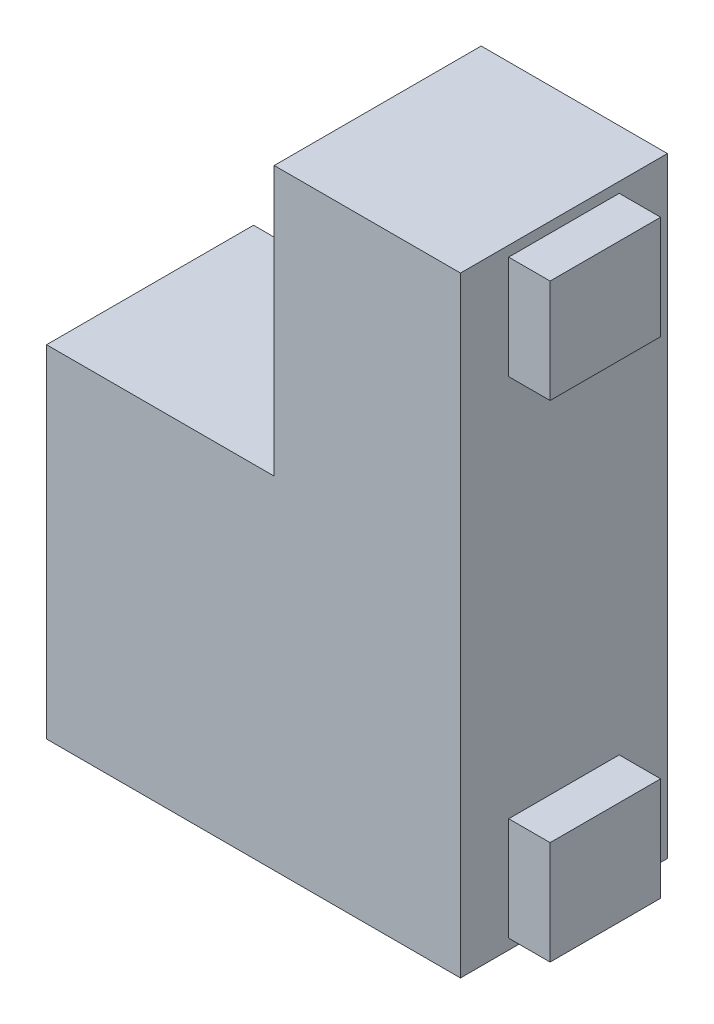
ISO-10303-21;
HEADER;
FILE_DESCRIPTION(('STEP AP214'),'2;1');
FILE_NAME('part.step','',(''),(''),'','','');
FILE_SCHEMA(('AUTOMOTIVE_DESIGN { 1 0 10303 214 1 1 1 1 }'));
ENDSEC;
DATA;
#1=APPLICATION_CONTEXT('core data for automotive mechanical design processes');
#2=APPLICATION_PROTOCOL_DEFINITION('international standard','automotive_design',2000,#1);
#3=PRODUCT_CONTEXT('',#1,'mechanical');
#4=PRODUCT('Part','Part','',(#3));
#5=PRODUCT_RELATED_PRODUCT_CATEGORY('part','',(#4));
#6=PRODUCT_DEFINITION_FORMATION('','',#4);
#7=PRODUCT_DEFINITION_CONTEXT('part definition',#1,'design');
#8=PRODUCT_DEFINITION('design','',#6,#7);
#9=PRODUCT_DEFINITION_SHAPE('','',#8);
#10=(LENGTH_UNIT() NAMED_UNIT(*) SI_UNIT(.MILLI.,.METRE.));
#11=(NAMED_UNIT(*) PLANE_ANGLE_UNIT() SI_UNIT($,.RADIAN.));
#12=(NAMED_UNIT(*) SI_UNIT($,.STERADIAN.) SOLID_ANGLE_UNIT());
#13=UNCERTAINTY_MEASURE_WITH_UNIT(LENGTH_MEASURE(1.E-05),#10,'distance_accuracy_value','');
#14=(GEOMETRIC_REPRESENTATION_CONTEXT(3) GLOBAL_UNCERTAINTY_ASSIGNED_CONTEXT((#13)) GLOBAL_UNIT_ASSIGNED_CONTEXT((#10,
#11,#12)) REPRESENTATION_CONTEXT('',''));
#15=CARTESIAN_POINT('',(0.,0.,0.));
#16=DIRECTION('',(0.,0.,1.));
#17=DIRECTION('',(1.,0.,0.));
#18=AXIS2_PLACEMENT_3D('',#15,#16,#17);
#19=CARTESIAN_POINT('',(12.699247036716,0.,20.));
#20=DIRECTION('',(1.,0.,0.));
#21=DIRECTION('',(0.,1.,0.));
#22=AXIS2_PLACEMENT_3D('',#19,#20,#21);
#23=PLANE('',#22);
#24=DIRECTION('',(0.,0.,1.));
#25=VECTOR('',#24,1.);
#26=CARTESIAN_POINT('',(12.699247036716,20.634721824497,20.));
#27=LINE('',#26,#25);
#28=CARTESIAN_POINT('',(12.699247036716,20.634721824497,15.33976514167));
#29=VERTEX_POINT('',#28);
#30=CARTESIAN_POINT('',(12.699247036716,20.634721824497,4.66023485833));
#31=VERTEX_POINT('',#30);
#32=EDGE_CURVE('E143',#29,#31,#27,.F.);
#33=ORIENTED_EDGE('',*,*,#32,.T.);
#34=DIRECTION('',(0.,1.,0.));
#35=VECTOR('',#34,1.);
#36=CARTESIAN_POINT('',(12.699247036716,31.634721824497,4.66023485833));
#37=LINE('',#36,#35);
#38=CARTESIAN_POINT('',(12.699247036716,30.634721824497,4.66023485833));
#39=VERTEX_POINT('',#38);
#40=EDGE_CURVE('E116',#31,#39,#37,.T.);
#41=ORIENTED_EDGE('',*,*,#40,.T.);
#42=DIRECTION('',(0.,0.,-1.));
#43=VECTOR('',#42,1.);
#44=CARTESIAN_POINT('',(12.699247036716,30.634721824497,54.66023485833));
#45=LINE('',#44,#43);
#46=CARTESIAN_POINT('',(12.699247036716,30.634721824497,15.33976514167));
#47=VERTEX_POINT('',#46);
#48=EDGE_CURVE('E128',#39,#47,#45,.F.);
#49=ORIENTED_EDGE('',*,*,#48,.T.);
#50=DIRECTION('',(0.,1.,0.));
#51=VECTOR('',#50,1.);
#52=CARTESIAN_POINT('',(12.699247036716,31.634721824497,15.33976514167));
#53=LINE('',#52,#51);
#54=EDGE_CURVE('E20',#47,#29,#53,.F.);
#55=ORIENTED_EDGE('',*,*,#54,.T.);
#56=EDGE_LOOP('',(#33,#41,#49,#55));
#57=FACE_BOUND('',#56,.T.);
#58=ADVANCED_FACE('F17',(#57),#23,.T.);
#59=CARTESIAN_POINT('',(12.699247036716,0.,20.));
#60=DIRECTION('',(-1.,0.,0.));
#61=DIRECTION('',(0.,-1.,0.));
#62=AXIS2_PLACEMENT_3D('',#59,#60,#61);
#63=PLANE('',#62);
#64=DIRECTION('',(0.,0.,1.));
#65=VECTOR('',#64,1.);
#66=CARTESIAN_POINT('',(12.699247036716,-26.3652781755,54.66023485833));
#67=LINE('',#66,#65);
#68=CARTESIAN_POINT('',(12.699247036716,-26.3652781755,15.33976514167));
#69=VERTEX_POINT('',#68);
#70=CARTESIAN_POINT('',(12.699247036716,-26.3652781755,4.66023485833));
#71=VERTEX_POINT('',#70);
#72=EDGE_CURVE('E145',#69,#71,#67,.F.);
#73=ORIENTED_EDGE('',*,*,#72,.T.);
#74=DIRECTION('',(0.,1.,0.));
#75=VECTOR('',#74,1.);
#76=CARTESIAN_POINT('',(12.699247036716,-27.3652781755,4.66023485833));
#77=LINE('',#76,#75);
#78=CARTESIAN_POINT('',(12.699247036716,-16.3652781755,4.66023485833));
#79=VERTEX_POINT('',#78);
#80=EDGE_CURVE('E161',#71,#79,#77,.T.);
#81=ORIENTED_EDGE('',*,*,#80,.T.);
#82=DIRECTION('',(0.,0.,1.));
#83=VECTOR('',#82,1.);
#84=CARTESIAN_POINT('',(12.699247036716,-16.3652781755,20.));
#85=LINE('',#84,#83);
#86=CARTESIAN_POINT('',(12.699247036716,-16.3652781755,15.33976514167));
#87=VERTEX_POINT('',#86);
#88=EDGE_CURVE('E154',#87,#79,#85,.F.);
#89=ORIENTED_EDGE('',*,*,#88,.F.);
#90=DIRECTION('',(0.,1.,0.));
#91=VECTOR('',#90,1.);
#92=CARTESIAN_POINT('',(12.699247036716,-27.3652781755,15.33976514167));
#93=LINE('',#92,#91);
#94=EDGE_CURVE('E147',#87,#69,#93,.F.);
#95=ORIENTED_EDGE('',*,*,#94,.T.);
#96=EDGE_LOOP('',(#73,#81,#89,#95));
#97=FACE_BOUND('',#96,.T.);
#98=ADVANCED_FACE('F401',(#97),#63,.F.);
#99=CARTESIAN_POINT('',(8.699247036716,31.634721824497,15.33976514167));
#100=DIRECTION('',(0.,0.,-1.));
#101=DIRECTION('',(-1.,0.,0.));
#102=AXIS2_PLACEMENT_3D('',#99,#100,#101);
#103=PLANE('',#102);
#104=DIRECTION('',(1.,0.,0.));
#105=VECTOR('',#104,1.);
#106=CARTESIAN_POINT('',(12.699247036716,30.634721824497,15.33976514167));
#107=LINE('',#106,#105);
#108=CARTESIAN_POINT('',(8.699247036716,30.634721824497,15.33976514167));
#109=VERTEX_POINT('',#108);
#110=EDGE_CURVE('E123',#47,#109,#107,.F.);
#111=ORIENTED_EDGE('',*,*,#110,.T.);
#112=DIRECTION('',(0.,1.,0.));
#113=VECTOR('',#112,1.);
#114=CARTESIAN_POINT('',(8.699247036716,0.,15.33976514167));
#115=LINE('',#114,#113);
#116=CARTESIAN_POINT('',(8.699247036716,20.634721824497,15.33976514167));
#117=VERTEX_POINT('',#116);
#118=EDGE_CURVE('E164',#117,#109,#115,.T.);
#119=ORIENTED_EDGE('',*,*,#118,.F.);
#120=DIRECTION('',(1.,0.,0.));
#121=VECTOR('',#120,1.);
#122=CARTESIAN_POINT('',(0.,20.634721824497,15.33976514167));
#123=LINE('',#122,#121);
#124=EDGE_CURVE('E126',#117,#29,#123,.T.);
#125=ORIENTED_EDGE('',*,*,#124,.T.);
#126=ORIENTED_EDGE('',*,*,#54,.F.);
#127=EDGE_LOOP('',(#111,#119,#125,#126));
#128=FACE_BOUND('',#127,.T.);
#129=ADVANCED_FACE('F121',(#128),#103,.F.);
#130=CARTESIAN_POINT('',(12.699247036716,30.634721824497,54.66023485833));
#131=DIRECTION('',(0.,-1.,0.));
#132=DIRECTION('',(0.,0.,-1.));
#133=AXIS2_PLACEMENT_3D('',#130,#131,#132);
#134=PLANE('',#133);
#135=DIRECTION('',(1.,0.,0.));
#136=VECTOR('',#135,1.);
#137=CARTESIAN_POINT('',(8.699247036716,30.634721824497,4.66023485833));
#138=LINE('',#137,#136);
#139=CARTESIAN_POINT('',(8.699247036716,30.634721824497,4.66023485833));
#140=VERTEX_POINT('',#139);
#141=EDGE_CURVE('E138',#39,#140,#138,.F.);
#142=ORIENTED_EDGE('',*,*,#141,.T.);
#143=DIRECTION('',(0.,0.,1.));
#144=VECTOR('',#143,1.);
#145=CARTESIAN_POINT('',(8.69924703671599,30.634721824497,20.));
#146=LINE('',#145,#144);
#147=EDGE_CURVE('E134',#109,#140,#146,.F.);
#148=ORIENTED_EDGE('',*,*,#147,.F.);
#149=ORIENTED_EDGE('',*,*,#110,.F.);
#150=ORIENTED_EDGE('',*,*,#48,.F.);
#151=EDGE_LOOP('',(#142,#148,#149,#150));
#152=FACE_BOUND('',#151,.T.);
#153=ADVANCED_FACE('F132',(#152),#134,.F.);
#154=CARTESIAN_POINT('',(8.699247036716,31.634721824497,4.66023485833));
#155=DIRECTION('',(0.,0.,1.));
#156=DIRECTION('',(1.,0.,0.));
#157=AXIS2_PLACEMENT_3D('',#154,#155,#156);
#158=PLANE('',#157);
#159=ORIENTED_EDGE('',*,*,#141,.F.);
#160=ORIENTED_EDGE('',*,*,#40,.F.);
#161=DIRECTION('',(1.,0.,0.));
#162=VECTOR('',#161,1.);
#163=CARTESIAN_POINT('',(0.,20.634721824497,4.66023485833));
#164=LINE('',#163,#162);
#165=CARTESIAN_POINT('',(8.699247036716,20.634721824497,4.66023485833));
#166=VERTEX_POINT('',#165);
#167=EDGE_CURVE('E140',#31,#166,#164,.F.);
#168=ORIENTED_EDGE('',*,*,#167,.T.);
#169=DIRECTION('',(0.,1.,0.));
#170=VECTOR('',#169,1.);
#171=CARTESIAN_POINT('',(8.699247036716,0.,4.66023485833));
#172=LINE('',#171,#170);
#173=EDGE_CURVE('E167',#140,#166,#172,.F.);
#174=ORIENTED_EDGE('',*,*,#173,.F.);
#175=EDGE_LOOP('',(#159,#160,#168,#174));
#176=FACE_BOUND('',#175,.T.);
#177=ADVANCED_FACE('F377',(#176),#158,.F.);
#178=CARTESIAN_POINT('',(0.,20.634721824497,20.));
#179=DIRECTION('',(0.,1.,0.));
#180=DIRECTION('',(0.,0.,1.));
#181=AXIS2_PLACEMENT_3D('',#178,#179,#180);
#182=PLANE('',#181);
#183=ORIENTED_EDGE('',*,*,#124,.F.);
#184=DIRECTION('',(0.,0.,1.));
#185=VECTOR('',#184,1.);
#186=CARTESIAN_POINT('',(8.699247036716,20.634721824497,20.));
#187=LINE('',#186,#185);
#188=EDGE_CURVE('E170',#166,#117,#187,.T.);
#189=ORIENTED_EDGE('',*,*,#188,.F.);
#190=ORIENTED_EDGE('',*,*,#167,.F.);
#191=ORIENTED_EDGE('',*,*,#32,.F.);
#192=EDGE_LOOP('',(#183,#189,#190,#191));
#193=FACE_BOUND('',#192,.T.);
#194=ADVANCED_FACE('F368',(#193),#182,.F.);
#195=CARTESIAN_POINT('',(12.699247036716,-26.3652781755,54.66023485833));
#196=DIRECTION('',(0.,1.,0.));
#197=DIRECTION('',(0.,0.,1.));
#198=AXIS2_PLACEMENT_3D('',#195,#196,#197);
#199=PLANE('',#198);
#200=DIRECTION('',(1.,0.,0.));
#201=VECTOR('',#200,1.);
#202=CARTESIAN_POINT('',(8.699247036716,-26.3652781755,4.66023485833));
#203=LINE('',#202,#201);
#204=CARTESIAN_POINT('',(8.699247036716,-26.3652781755,4.66023485833));
#205=VERTEX_POINT('',#204);
#206=EDGE_CURVE('E158',#205,#71,#203,.T.);
#207=ORIENTED_EDGE('',*,*,#206,.T.);
#208=ORIENTED_EDGE('',*,*,#72,.F.);
#209=DIRECTION('',(-1.,0.,0.));
#210=VECTOR('',#209,1.);
#211=CARTESIAN_POINT('',(8.699247036716,-26.3652781755,15.33976514167));
#212=LINE('',#211,#210);
#213=CARTESIAN_POINT('',(8.699247036716,-26.3652781755,15.33976514167));
#214=VERTEX_POINT('',#213);
#215=EDGE_CURVE('E149',#69,#214,#212,.T.);
#216=ORIENTED_EDGE('',*,*,#215,.T.);
#217=DIRECTION('',(0.,0.,1.));
#218=VECTOR('',#217,1.);
#219=CARTESIAN_POINT('',(8.69924703671601,-26.3652781755,20.));
#220=LINE('',#219,#218);
#221=EDGE_CURVE('E176',#205,#214,#220,.T.);
#222=ORIENTED_EDGE('',*,*,#221,.F.);
#223=EDGE_LOOP('',(#207,#208,#216,#222));
#224=FACE_BOUND('',#223,.T.);
#225=ADVANCED_FACE('F359',(#224),#199,.F.);
#226=CARTESIAN_POINT('',(8.699247036716,-27.3652781755,15.33976514167));
#227=DIRECTION('',(0.,0.,-1.));
#228=DIRECTION('',(-1.,0.,0.));
#229=AXIS2_PLACEMENT_3D('',#226,#227,#228);
#230=PLANE('',#229);
#231=ORIENTED_EDGE('',*,*,#215,.F.);
#232=ORIENTED_EDGE('',*,*,#94,.F.);
#233=DIRECTION('',(1.,0.,0.));
#234=VECTOR('',#233,1.);
#235=CARTESIAN_POINT('',(0.,-16.3652781755,15.33976514167));
#236=LINE('',#235,#234);
#237=CARTESIAN_POINT('',(8.699247036716,-16.3652781755,15.33976514167));
#238=VERTEX_POINT('',#237);
#239=EDGE_CURVE('E151',#238,#87,#236,.T.);
#240=ORIENTED_EDGE('',*,*,#239,.F.);
#241=DIRECTION('',(0.,1.,0.));
#242=VECTOR('',#241,1.);
#243=CARTESIAN_POINT('',(8.699247036716,0.,15.33976514167));
#244=LINE('',#243,#242);
#245=EDGE_CURVE('E179',#214,#238,#244,.T.);
#246=ORIENTED_EDGE('',*,*,#245,.F.);
#247=EDGE_LOOP('',(#231,#232,#240,#246));
#248=FACE_BOUND('',#247,.T.);
#249=ADVANCED_FACE('F350',(#248),#230,.F.);
#250=CARTESIAN_POINT('',(0.,-16.3652781755,20.));
#251=DIRECTION('',(0.,1.,0.));
#252=DIRECTION('',(0.,0.,1.));
#253=AXIS2_PLACEMENT_3D('',#250,#251,#252);
#254=PLANE('',#253);
#255=ORIENTED_EDGE('',*,*,#239,.T.);
#256=ORIENTED_EDGE('',*,*,#88,.T.);
#257=DIRECTION('',(1.,0.,0.));
#258=VECTOR('',#257,1.);
#259=CARTESIAN_POINT('',(8.699247036716,-16.3652781755,4.66023485833));
#260=LINE('',#259,#258);
#261=CARTESIAN_POINT('',(8.699247036716,-16.3652781755,4.66023485833));
#262=VERTEX_POINT('',#261);
#263=EDGE_CURVE('E156',#79,#262,#260,.F.);
#264=ORIENTED_EDGE('',*,*,#263,.T.);
#265=DIRECTION('',(0.,0.,1.));
#266=VECTOR('',#265,1.);
#267=CARTESIAN_POINT('',(8.699247036716,-16.3652781755,20.));
#268=LINE('',#267,#266);
#269=EDGE_CURVE('E182',#238,#262,#268,.F.);
#270=ORIENTED_EDGE('',*,*,#269,.F.);
#271=EDGE_LOOP('',(#255,#256,#264,#270));
#272=FACE_BOUND('',#271,.T.);
#273=ADVANCED_FACE('F341',(#272),#254,.T.);
#274=CARTESIAN_POINT('',(8.699247036716,-27.3652781755,4.66023485833));
#275=DIRECTION('',(0.,0.,1.));
#276=DIRECTION('',(1.,0.,0.));
#277=AXIS2_PLACEMENT_3D('',#274,#275,#276);
#278=PLANE('',#277);
#279=ORIENTED_EDGE('',*,*,#206,.F.);
#280=DIRECTION('',(0.,1.,0.));
#281=VECTOR('',#280,1.);
#282=CARTESIAN_POINT('',(8.699247036716,0.,4.66023485833));
#283=LINE('',#282,#281);
#284=EDGE_CURVE('E185',#262,#205,#283,.F.);
#285=ORIENTED_EDGE('',*,*,#284,.F.);
#286=ORIENTED_EDGE('',*,*,#263,.F.);
#287=ORIENTED_EDGE('',*,*,#80,.F.);
#288=EDGE_LOOP('',(#279,#285,#286,#287));
#289=FACE_BOUND('',#288,.T.);
#290=ADVANCED_FACE('F332',(#289),#278,.F.);
#291=CARTESIAN_POINT('',(0.,0.,0.));
#292=DIRECTION('',(0.,0.,1.));
#293=DIRECTION('',(1.,0.,0.));
#294=AXIS2_PLACEMENT_3D('',#291,#292,#293);
#295=PLANE('',#294);
#296=DIRECTION('',(1.,0.,0.));
#297=VECTOR('',#296,1.);
#298=CARTESIAN_POINT('',(0.,-27.3652781755,0.));
#299=LINE('',#298,#297);
#300=CARTESIAN_POINT('',(8.699247036716,-27.3652781755,0.));
#301=VERTEX_POINT('',#300);
#302=CARTESIAN_POINT('',(-31.30075296328,-27.3652781755,0.));
#303=VERTEX_POINT('',#302);
#304=EDGE_CURVE('E208',#301,#303,#299,.F.);
#305=ORIENTED_EDGE('',*,*,#304,.T.);
#306=DIRECTION('',(0.,1.,0.));
#307=VECTOR('',#306,1.);
#308=CARTESIAN_POINT('',(-31.30075296328,0.,0.));
#309=LINE('',#308,#307);
#310=CARTESIAN_POINT('',(-31.30075296328,5.634721824497,0.));
#311=VERTEX_POINT('',#310);
#312=EDGE_CURVE('E205',#303,#311,#309,.T.);
#313=ORIENTED_EDGE('',*,*,#312,.T.);
#314=DIRECTION('',(1.,0.,0.));
#315=VECTOR('',#314,1.);
#316=CARTESIAN_POINT('',(0.,5.634721824497,0.));
#317=LINE('',#316,#315);
#318=CARTESIAN_POINT('',(-9.300752963284,5.634721824497,0.));
#319=VERTEX_POINT('',#318);
#320=EDGE_CURVE('E198',#319,#311,#317,.F.);
#321=ORIENTED_EDGE('',*,*,#320,.F.);
#322=DIRECTION('',(0.,-1.,0.));
#323=VECTOR('',#322,1.);
#324=CARTESIAN_POINT('',(-9.300752963284,0.,0.));
#325=LINE('',#324,#323);
#326=CARTESIAN_POINT('',(-9.300752963284,31.634721824497,0.));
#327=VERTEX_POINT('',#326);
#328=EDGE_CURVE('E192',#327,#319,#325,.T.);
#329=ORIENTED_EDGE('',*,*,#328,.F.);
#330=DIRECTION('',(1.,0.,0.));
#331=VECTOR('',#330,1.);
#332=CARTESIAN_POINT('',(0.,31.634721824497,0.));
#333=LINE('',#332,#331);
#334=CARTESIAN_POINT('',(8.699247036716,31.634721824497,0.));
#335=VERTEX_POINT('',#334);
#336=EDGE_CURVE('E188',#327,#335,#333,.T.);
#337=ORIENTED_EDGE('',*,*,#336,.T.);
#338=DIRECTION('',(0.,1.,0.));
#339=VECTOR('',#338,1.);
#340=CARTESIAN_POINT('',(8.699247036716,0.,0.));
#341=LINE('',#340,#339);
#342=EDGE_CURVE('E173',#301,#335,#341,.T.);
#343=ORIENTED_EDGE('',*,*,#342,.F.);
#344=EDGE_LOOP('',(#305,#313,#321,#329,#337,#343));
#345=FACE_BOUND('',#344,.T.);
#346=ADVANCED_FACE('F235',(#345),#295,.F.);
#347=CARTESIAN_POINT('',(8.699247036716,0.,20.));
#348=DIRECTION('',(1.,0.,0.));
#349=DIRECTION('',(0.,1.,0.));
#350=AXIS2_PLACEMENT_3D('',#347,#348,#349);
#351=PLANE('',#350);
#352=ORIENTED_EDGE('',*,*,#269,.T.);
#353=ORIENTED_EDGE('',*,*,#284,.T.);
#354=ORIENTED_EDGE('',*,*,#221,.T.);
#355=ORIENTED_EDGE('',*,*,#245,.T.);
#356=EDGE_LOOP('',(#352,#353,#354,#355));
#357=FACE_BOUND('',#356,.T.);
#358=ORIENTED_EDGE('',*,*,#342,.T.);
#359=DIRECTION('',(0.,0.,-1.));
#360=VECTOR('',#359,1.);
#361=CARTESIAN_POINT('',(8.699247036716,31.634721824497,20.));
#362=LINE('',#361,#360);
#363=CARTESIAN_POINT('',(8.699247036716,31.634721824497,20.));
#364=VERTEX_POINT('',#363);
#365=EDGE_CURVE('E190',#335,#364,#362,.F.);
#366=ORIENTED_EDGE('',*,*,#365,.T.);
#367=DIRECTION('',(0.,1.,0.));
#368=VECTOR('',#367,1.);
#369=CARTESIAN_POINT('',(8.699247036716,0.,20.));
#370=LINE('',#369,#368);
#371=CARTESIAN_POINT('',(8.699247036716,-27.3652781755,20.));
#372=VERTEX_POINT('',#371);
#373=EDGE_CURVE('E214',#372,#364,#370,.T.);
#374=ORIENTED_EDGE('',*,*,#373,.F.);
#375=DIRECTION('',(0.,0.,1.));
#376=VECTOR('',#375,1.);
#377=CARTESIAN_POINT('',(8.699247036716,-27.3652781755,20.));
#378=LINE('',#377,#376);
#379=EDGE_CURVE('E211',#372,#301,#378,.F.);
#380=ORIENTED_EDGE('',*,*,#379,.T.);
#381=EDGE_LOOP('',(#358,#366,#374,#380));
#382=FACE_BOUND('',#381,.T.);
#383=ORIENTED_EDGE('',*,*,#173,.T.);
#384=ORIENTED_EDGE('',*,*,#188,.T.);
#385=ORIENTED_EDGE('',*,*,#118,.T.);
#386=ORIENTED_EDGE('',*,*,#147,.T.);
#387=EDGE_LOOP('',(#383,#384,#385,#386));
#388=FACE_BOUND('',#387,.T.);
#389=ADVANCED_FACE('F241',(#357,#382,#388),#351,.T.);
#390=CARTESIAN_POINT('',(0.,31.634721824497,20.));
#391=DIRECTION('',(0.,-1.,0.));
#392=DIRECTION('',(0.,0.,-1.));
#393=AXIS2_PLACEMENT_3D('',#390,#391,#392);
#394=PLANE('',#393);
#395=ORIENTED_EDGE('',*,*,#336,.F.);
#396=DIRECTION('',(0.,0.,1.));
#397=VECTOR('',#396,1.);
#398=CARTESIAN_POINT('',(-9.30075296328401,31.634721824497,20.));
#399=LINE('',#398,#397);
#400=CARTESIAN_POINT('',(-9.300752963284,31.634721824497,20.));
#401=VERTEX_POINT('',#400);
#402=EDGE_CURVE('E195',#401,#327,#399,.F.);
#403=ORIENTED_EDGE('',*,*,#402,.F.);
#404=DIRECTION('',(1.,0.,0.));
#405=VECTOR('',#404,1.);
#406=CARTESIAN_POINT('',(0.,31.634721824497,20.));
#407=LINE('',#406,#405);
#408=EDGE_CURVE('E217',#364,#401,#407,.F.);
#409=ORIENTED_EDGE('',*,*,#408,.F.);
#410=ORIENTED_EDGE('',*,*,#365,.F.);
#411=EDGE_LOOP('',(#395,#403,#409,#410));
#412=FACE_BOUND('',#411,.T.);
#413=ADVANCED_FACE('F248',(#412),#394,.F.);
#414=CARTESIAN_POINT('',(-9.300752963284,0.,20.));
#415=DIRECTION('',(-1.,0.,0.));
#416=DIRECTION('',(0.,-1.,0.));
#417=AXIS2_PLACEMENT_3D('',#414,#415,#416);
#418=PLANE('',#417);
#419=DIRECTION('',(0.,1.,0.));
#420=VECTOR('',#419,1.);
#421=CARTESIAN_POINT('',(-9.300752963284,0.,20.));
#422=LINE('',#421,#420);
#423=CARTESIAN_POINT('',(-9.300752963284,5.634721824497,20.));
#424=VERTEX_POINT('',#423);
#425=EDGE_CURVE('E220',#401,#424,#422,.F.);
#426=ORIENTED_EDGE('',*,*,#425,.F.);
#427=ORIENTED_EDGE('',*,*,#402,.T.);
#428=ORIENTED_EDGE('',*,*,#328,.T.);
#429=DIRECTION('',(0.,0.,1.));
#430=VECTOR('',#429,1.);
#431=CARTESIAN_POINT('',(-9.300752963284,5.634721824497,20.));
#432=LINE('',#431,#430);
#433=EDGE_CURVE('E200',#424,#319,#432,.F.);
#434=ORIENTED_EDGE('',*,*,#433,.F.);
#435=EDGE_LOOP('',(#426,#427,#428,#434));
#436=FACE_BOUND('',#435,.T.);
#437=ADVANCED_FACE('F250',(#436),#418,.T.);
#438=CARTESIAN_POINT('',(0.,5.634721824497,20.));
#439=DIRECTION('',(0.,1.,0.));
#440=DIRECTION('',(0.,0.,1.));
#441=AXIS2_PLACEMENT_3D('',#438,#439,#440);
#442=PLANE('',#441);
#443=DIRECTION('',(1.,0.,0.));
#444=VECTOR('',#443,1.);
#445=CARTESIAN_POINT('',(0.,5.634721824497,20.));
#446=LINE('',#445,#444);
#447=CARTESIAN_POINT('',(-31.30075296328,5.634721824497,20.));
#448=VERTEX_POINT('',#447);
#449=EDGE_CURVE('E223',#424,#448,#446,.F.);
#450=ORIENTED_EDGE('',*,*,#449,.F.);
#451=ORIENTED_EDGE('',*,*,#433,.T.);
#452=ORIENTED_EDGE('',*,*,#320,.T.);
#453=DIRECTION('',(0.,0.,-1.));
#454=VECTOR('',#453,1.);
#455=CARTESIAN_POINT('',(-31.30075296328,5.634721824497,20.));
#456=LINE('',#455,#454);
#457=EDGE_CURVE('E203',#311,#448,#456,.F.);
#458=ORIENTED_EDGE('',*,*,#457,.T.);
#459=EDGE_LOOP('',(#450,#451,#452,#458));
#460=FACE_BOUND('',#459,.T.);
#461=ADVANCED_FACE('F233',(#460),#442,.T.);
#462=CARTESIAN_POINT('',(-31.30075296328,0.,20.));
#463=DIRECTION('',(1.,0.,0.));
#464=DIRECTION('',(0.,0.,-1.));
#465=AXIS2_PLACEMENT_3D('',#462,#463,#464);
#466=PLANE('',#465);
#467=DIRECTION('',(0.,0.,1.));
#468=VECTOR('',#467,1.);
#469=CARTESIAN_POINT('',(-31.30075296328,-27.3652781755,20.));
#470=LINE('',#469,#468);
#471=CARTESIAN_POINT('',(-31.30075296328,-27.3652781755,20.));
#472=VERTEX_POINT('',#471);
#473=EDGE_CURVE('E35',#303,#472,#470,.T.);
#474=ORIENTED_EDGE('',*,*,#473,.T.);
#475=DIRECTION('',(0.,1.,0.));
#476=VECTOR('',#475,1.);
#477=CARTESIAN_POINT('',(-31.30075296328,0.,20.));
#478=LINE('',#477,#476);
#479=EDGE_CURVE('E26',#448,#472,#478,.F.);
#480=ORIENTED_EDGE('',*,*,#479,.F.);
#481=ORIENTED_EDGE('',*,*,#457,.F.);
#482=ORIENTED_EDGE('',*,*,#312,.F.);
#483=EDGE_LOOP('',(#474,#480,#481,#482));
#484=FACE_BOUND('',#483,.T.);
#485=ADVANCED_FACE('F231',(#484),#466,.F.);
#486=CARTESIAN_POINT('',(0.,-27.3652781755,20.));
#487=DIRECTION('',(0.,1.,0.));
#488=DIRECTION('',(0.,0.,1.));
#489=AXIS2_PLACEMENT_3D('',#486,#487,#488);
#490=PLANE('',#489);
#491=DIRECTION('',(1.,0.,0.));
#492=VECTOR('',#491,1.);
#493=CARTESIAN_POINT('',(0.,-27.3652781755,20.));
#494=LINE('',#493,#492);
#495=EDGE_CURVE('E11',#472,#372,#494,.T.);
#496=ORIENTED_EDGE('',*,*,#495,.F.);
#497=ORIENTED_EDGE('',*,*,#473,.F.);
#498=ORIENTED_EDGE('',*,*,#304,.F.);
#499=ORIENTED_EDGE('',*,*,#379,.F.);
#500=EDGE_LOOP('',(#496,#497,#498,#499));
#501=FACE_BOUND('',#500,.T.);
#502=ADVANCED_FACE('F239',(#501),#490,.F.);
#503=CARTESIAN_POINT('',(0.,0.,20.));
#504=DIRECTION('',(0.,0.,1.));
#505=DIRECTION('',(1.,0.,0.));
#506=AXIS2_PLACEMENT_3D('',#503,#504,#505);
#507=PLANE('',#506);
#508=ORIENTED_EDGE('',*,*,#479,.T.);
#509=ORIENTED_EDGE('',*,*,#495,.T.);
#510=ORIENTED_EDGE('',*,*,#373,.T.);
#511=ORIENTED_EDGE('',*,*,#408,.T.);
#512=ORIENTED_EDGE('',*,*,#425,.T.);
#513=ORIENTED_EDGE('',*,*,#449,.T.);
#514=EDGE_LOOP('',(#508,#509,#510,#511,#512,#513));
#515=FACE_BOUND('',#514,.T.);
#516=ADVANCED_FACE('F228',(#515),#507,.T.);
#517=CLOSED_SHELL('',(#58,#98,#129,#153,#177,#194,#225,#249,#273,#290,#346,#389,#413,#437,#461,
#485,#502,#516));
#518=MANIFOLD_SOLID_BREP('B1',#517);
#519=ADVANCED_BREP_SHAPE_REPRESENTATION('',(#18,#518),#14);
#520=SHAPE_DEFINITION_REPRESENTATION(#9,#519);
ENDSEC;
END-ISO-10303-21;
